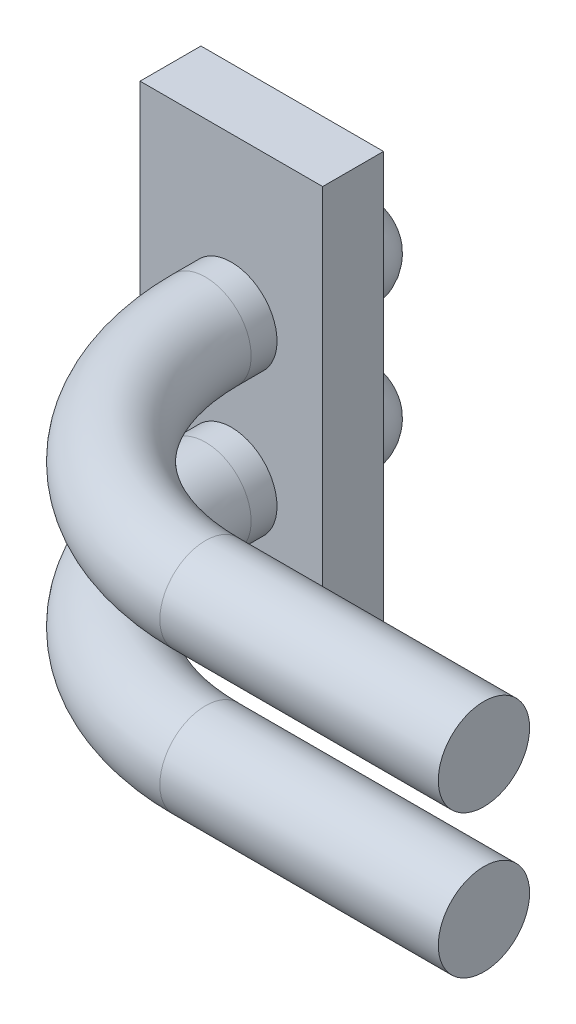
ISO-10303-21;
HEADER;
FILE_DESCRIPTION(('STEP AP214'),'2;1');
FILE_NAME('part.step','',(''),(''),'','','');
FILE_SCHEMA(('AUTOMOTIVE_DESIGN { 1 0 10303 214 1 1 1 1 }'));
ENDSEC;
DATA;
#1=APPLICATION_CONTEXT('core data for automotive mechanical design processes');
#2=APPLICATION_PROTOCOL_DEFINITION('international standard','automotive_design',2000,#1);
#3=PRODUCT_CONTEXT('',#1,'mechanical');
#4=PRODUCT('Part','Part','',(#3));
#5=PRODUCT_RELATED_PRODUCT_CATEGORY('part','',(#4));
#6=PRODUCT_DEFINITION_FORMATION('','',#4);
#7=PRODUCT_DEFINITION_CONTEXT('part definition',#1,'design');
#8=PRODUCT_DEFINITION('design','',#6,#7);
#9=PRODUCT_DEFINITION_SHAPE('','',#8);
#10=(LENGTH_UNIT() NAMED_UNIT(*) SI_UNIT(.MILLI.,.METRE.));
#11=(NAMED_UNIT(*) PLANE_ANGLE_UNIT() SI_UNIT($,.RADIAN.));
#12=(NAMED_UNIT(*) SI_UNIT($,.STERADIAN.) SOLID_ANGLE_UNIT());
#13=UNCERTAINTY_MEASURE_WITH_UNIT(LENGTH_MEASURE(1.E-05),#10,'distance_accuracy_value','');
#14=(GEOMETRIC_REPRESENTATION_CONTEXT(3) GLOBAL_UNCERTAINTY_ASSIGNED_CONTEXT((#13)) GLOBAL_UNIT_ASSIGNED_CONTEXT((#10,
#11,#12)) REPRESENTATION_CONTEXT('',''));
#15=CARTESIAN_POINT('',(0.,0.,0.));
#16=DIRECTION('',(0.,0.,1.));
#17=DIRECTION('',(1.,0.,0.));
#18=AXIS2_PLACEMENT_3D('',#15,#16,#17);
#19=CARTESIAN_POINT('',(3.00000000000001,7.5,2.));
#20=DIRECTION('',(0.,0.,-1.));
#21=DIRECTION('',(-1.,0.,0.));
#22=AXIS2_PLACEMENT_3D('',#19,#20,#21);
#23=PLANE('',#22);
#24=CARTESIAN_POINT('',(0.,-2.35,2.));
#25=DIRECTION('',(0.,0.,1.));
#26=DIRECTION('',(1.,0.,0.));
#27=AXIS2_PLACEMENT_3D('',#24,#25,#26);
#28=CIRCLE('',#27,1.5);
#29=CARTESIAN_POINT('',(1.5,-2.35,2.));
#30=VERTEX_POINT('',#29);
#31=EDGE_CURVE('E41',#30,#30,#28,.T.);
#32=ORIENTED_EDGE('',*,*,#31,.F.);
#33=EDGE_LOOP('',(#32));
#34=FACE_BOUND('',#33,.T.);
#35=DIRECTION('',(0.,1.,0.));
#36=VECTOR('',#35,1.);
#37=CARTESIAN_POINT('',(3.00000000000001,-7.5,2.));
#38=LINE('',#37,#36);
#39=CARTESIAN_POINT('',(3.00000000000001,-7.5,2.));
#40=VERTEX_POINT('',#39);
#41=CARTESIAN_POINT('',(3.00000000000001,7.5,2.));
#42=VERTEX_POINT('',#41);
#43=EDGE_CURVE('E86',#40,#42,#38,.T.);
#44=ORIENTED_EDGE('',*,*,#43,.T.);
#45=DIRECTION('',(-1.,0.,0.));
#46=VECTOR('',#45,1.);
#47=CARTESIAN_POINT('',(-3.,7.5,2.));
#48=LINE('',#47,#46);
#49=CARTESIAN_POINT('',(-3.,7.5,2.));
#50=VERTEX_POINT('',#49);
#51=EDGE_CURVE('E81',#42,#50,#48,.T.);
#52=ORIENTED_EDGE('',*,*,#51,.T.);
#53=DIRECTION('',(0.,-1.,0.));
#54=VECTOR('',#53,1.);
#55=CARTESIAN_POINT('',(-3.,-7.5,2.));
#56=LINE('',#55,#54);
#57=CARTESIAN_POINT('',(-3.,-7.5,2.));
#58=VERTEX_POINT('',#57);
#59=EDGE_CURVE('E84',#50,#58,#56,.T.);
#60=ORIENTED_EDGE('',*,*,#59,.T.);
#61=DIRECTION('',(1.,0.,0.));
#62=VECTOR('',#61,1.);
#63=CARTESIAN_POINT('',(-3.,-7.5,2.));
#64=LINE('',#63,#62);
#65=EDGE_CURVE('E50',#58,#40,#64,.T.);
#66=ORIENTED_EDGE('',*,*,#65,.T.);
#67=EDGE_LOOP('',(#44,#52,#60,#66));
#68=FACE_BOUND('',#67,.T.);
#69=CARTESIAN_POINT('',(0.,2.35,2.));
#70=DIRECTION('',(0.,0.,1.));
#71=DIRECTION('',(1.,0.,0.));
#72=AXIS2_PLACEMENT_3D('',#69,#70,#71);
#73=CIRCLE('',#72,1.5);
#74=CARTESIAN_POINT('',(1.5,2.35,2.));
#75=VERTEX_POINT('',#74);
#76=EDGE_CURVE('E11',#75,#75,#73,.T.);
#77=ORIENTED_EDGE('',*,*,#76,.F.);
#78=EDGE_LOOP('',(#77));
#79=FACE_BOUND('',#78,.T.);
#80=ADVANCED_FACE('F31',(#34,#68,#79),#23,.F.);
#81=CARTESIAN_POINT('',(3.00000000000001,7.5,0.));
#82=DIRECTION('',(0.,0.,-1.));
#83=DIRECTION('',(-1.,0.,0.));
#84=AXIS2_PLACEMENT_3D('',#81,#82,#83);
#85=PLANE('',#84);
#86=CARTESIAN_POINT('',(0.,2.35,0.));
#87=DIRECTION('',(0.,0.,-1.));
#88=DIRECTION('',(-1.,0.,0.));
#89=AXIS2_PLACEMENT_3D('',#86,#87,#88);
#90=CIRCLE('',#89,1.5);
#91=CARTESIAN_POINT('',(-1.5,2.35,0.));
#92=VERTEX_POINT('',#91);
#93=EDGE_CURVE('E104',#92,#92,#90,.T.);
#94=ORIENTED_EDGE('',*,*,#93,.F.);
#95=EDGE_LOOP('',(#94));
#96=FACE_BOUND('',#95,.T.);
#97=DIRECTION('',(0.,1.,0.));
#98=VECTOR('',#97,1.);
#99=CARTESIAN_POINT('',(3.00000000000001,-7.5,0.));
#100=LINE('',#99,#98);
#101=CARTESIAN_POINT('',(3.00000000000001,-7.5,0.));
#102=VERTEX_POINT('',#101);
#103=CARTESIAN_POINT('',(3.00000000000001,7.5,0.));
#104=VERTEX_POINT('',#103);
#105=EDGE_CURVE('E101',#102,#104,#100,.T.);
#106=ORIENTED_EDGE('',*,*,#105,.F.);
#107=DIRECTION('',(1.,0.,0.));
#108=VECTOR('',#107,1.);
#109=CARTESIAN_POINT('',(-3.,-7.5,0.));
#110=LINE('',#109,#108);
#111=CARTESIAN_POINT('',(-3.,-7.5,0.));
#112=VERTEX_POINT('',#111);
#113=EDGE_CURVE('E73',#112,#102,#110,.T.);
#114=ORIENTED_EDGE('',*,*,#113,.F.);
#115=DIRECTION('',(0.,-1.,0.));
#116=VECTOR('',#115,1.);
#117=CARTESIAN_POINT('',(-3.,-7.5,0.));
#118=LINE('',#117,#116);
#119=CARTESIAN_POINT('',(-3.,7.5,0.));
#120=VERTEX_POINT('',#119);
#121=EDGE_CURVE('E67',#120,#112,#118,.T.);
#122=ORIENTED_EDGE('',*,*,#121,.F.);
#123=DIRECTION('',(-1.,0.,0.));
#124=VECTOR('',#123,1.);
#125=CARTESIAN_POINT('',(-3.,7.5,0.));
#126=LINE('',#125,#124);
#127=EDGE_CURVE('E91',#104,#120,#126,.T.);
#128=ORIENTED_EDGE('',*,*,#127,.F.);
#129=EDGE_LOOP('',(#106,#114,#122,#128));
#130=FACE_BOUND('',#129,.T.);
#131=CARTESIAN_POINT('',(0.,-2.35,0.));
#132=DIRECTION('',(0.,0.,-1.));
#133=DIRECTION('',(-1.,0.,0.));
#134=AXIS2_PLACEMENT_3D('',#131,#132,#133);
#135=CIRCLE('',#134,1.5);
#136=CARTESIAN_POINT('',(-1.5,-2.35,0.));
#137=VERTEX_POINT('',#136);
#138=EDGE_CURVE('E131',#137,#137,#135,.T.);
#139=ORIENTED_EDGE('',*,*,#138,.F.);
#140=EDGE_LOOP('',(#139));
#141=FACE_BOUND('',#140,.T.);
#142=ADVANCED_FACE('F139',(#96,#130,#141),#85,.T.);
#143=CARTESIAN_POINT('',(3.00000000000001,-7.5,2.));
#144=DIRECTION('',(-1.,0.,0.));
#145=DIRECTION('',(0.,0.,1.));
#146=AXIS2_PLACEMENT_3D('',#143,#144,#145);
#147=PLANE('',#146);
#148=ORIENTED_EDGE('',*,*,#105,.T.);
#149=DIRECTION('',(0.,0.,-1.));
#150=VECTOR('',#149,1.);
#151=CARTESIAN_POINT('',(3.00000000000001,7.5,2.));
#152=LINE('',#151,#150);
#153=EDGE_CURVE('E92',#42,#104,#152,.T.);
#154=ORIENTED_EDGE('',*,*,#153,.F.);
#155=ORIENTED_EDGE('',*,*,#43,.F.);
#156=DIRECTION('',(0.,0.,-1.));
#157=VECTOR('',#156,1.);
#158=CARTESIAN_POINT('',(3.00000000000001,-7.5,2.));
#159=LINE('',#158,#157);
#160=EDGE_CURVE('E97',#40,#102,#159,.T.);
#161=ORIENTED_EDGE('',*,*,#160,.T.);
#162=EDGE_LOOP('',(#148,#154,#155,#161));
#163=FACE_BOUND('',#162,.T.);
#164=ADVANCED_FACE('F142',(#163),#147,.F.);
#165=CARTESIAN_POINT('',(-3.,7.5,2.));
#166=DIRECTION('',(0.,-1.,0.));
#167=DIRECTION('',(0.,0.,-1.));
#168=AXIS2_PLACEMENT_3D('',#165,#166,#167);
#169=PLANE('',#168);
#170=ORIENTED_EDGE('',*,*,#127,.T.);
#171=DIRECTION('',(0.,0.,-1.));
#172=VECTOR('',#171,1.);
#173=CARTESIAN_POINT('',(-3.,7.5,2.));
#174=LINE('',#173,#172);
#175=EDGE_CURVE('E89',#50,#120,#174,.T.);
#176=ORIENTED_EDGE('',*,*,#175,.F.);
#177=ORIENTED_EDGE('',*,*,#51,.F.);
#178=ORIENTED_EDGE('',*,*,#153,.T.);
#179=EDGE_LOOP('',(#170,#176,#177,#178));
#180=FACE_BOUND('',#179,.T.);
#181=ADVANCED_FACE('F90',(#180),#169,.F.);
#182=CARTESIAN_POINT('',(-3.,-7.5,2.));
#183=DIRECTION('',(1.,0.,0.));
#184=DIRECTION('',(0.,0.,-1.));
#185=AXIS2_PLACEMENT_3D('',#182,#183,#184);
#186=PLANE('',#185);
#187=ORIENTED_EDGE('',*,*,#121,.T.);
#188=DIRECTION('',(0.,0.,-1.));
#189=VECTOR('',#188,1.);
#190=CARTESIAN_POINT('',(-3.,-7.5,2.));
#191=LINE('',#190,#189);
#192=EDGE_CURVE('E93',#58,#112,#191,.T.);
#193=ORIENTED_EDGE('',*,*,#192,.F.);
#194=ORIENTED_EDGE('',*,*,#59,.F.);
#195=ORIENTED_EDGE('',*,*,#175,.T.);
#196=EDGE_LOOP('',(#187,#193,#194,#195));
#197=FACE_BOUND('',#196,.T.);
#198=ADVANCED_FACE('F95',(#197),#186,.F.);
#199=CARTESIAN_POINT('',(-3.,-7.5,2.));
#200=DIRECTION('',(0.,1.,0.));
#201=DIRECTION('',(0.,0.,1.));
#202=AXIS2_PLACEMENT_3D('',#199,#200,#201);
#203=PLANE('',#202);
#204=ORIENTED_EDGE('',*,*,#113,.T.);
#205=ORIENTED_EDGE('',*,*,#160,.F.);
#206=ORIENTED_EDGE('',*,*,#65,.F.);
#207=ORIENTED_EDGE('',*,*,#192,.T.);
#208=EDGE_LOOP('',(#204,#205,#206,#207));
#209=FACE_BOUND('',#208,.T.);
#210=ADVANCED_FACE('F157',(#209),#203,.F.);
#211=CARTESIAN_POINT('',(0.,2.35,-3.));
#212=DIRECTION('',(0.,0.,1.));
#213=DIRECTION('',(1.,0.,0.));
#214=AXIS2_PLACEMENT_3D('',#211,#212,#213);
#215=CYLINDRICAL_SURFACE('',#214,1.5);
#216=CARTESIAN_POINT('',(0.,2.35,-1.5));
#217=DIRECTION('',(0.,0.,1.));
#218=DIRECTION('',(1.,0.,0.));
#219=AXIS2_PLACEMENT_3D('',#216,#217,#218);
#220=CIRCLE('',#219,1.5);
#221=CARTESIAN_POINT('',(1.5,2.35,-1.5));
#222=VERTEX_POINT('',#221);
#223=EDGE_CURVE('E35',#222,#222,#220,.T.);
#224=ORIENTED_EDGE('',*,*,#223,.T.);
#225=EDGE_LOOP('',(#224));
#226=FACE_BOUND('',#225,.T.);
#227=ORIENTED_EDGE('',*,*,#93,.T.);
#228=EDGE_LOOP('',(#227));
#229=FACE_BOUND('',#228,.T.);
#230=ADVANCED_FACE('F137',(#226,#229),#215,.T.);
#231=CARTESIAN_POINT('',(0.,-2.35,-3.));
#232=DIRECTION('',(0.,0.,1.));
#233=DIRECTION('',(1.,0.,0.));
#234=AXIS2_PLACEMENT_3D('',#231,#232,#233);
#235=CYLINDRICAL_SURFACE('',#234,1.5);
#236=CARTESIAN_POINT('',(0.,-2.35,-1.5));
#237=DIRECTION('',(0.,0.,1.));
#238=DIRECTION('',(1.,0.,0.));
#239=AXIS2_PLACEMENT_3D('',#236,#237,#238);
#240=CIRCLE('',#239,1.5);
#241=CARTESIAN_POINT('',(1.5,-2.35,-1.5));
#242=VERTEX_POINT('',#241);
#243=EDGE_CURVE('E110',#242,#242,#240,.T.);
#244=ORIENTED_EDGE('',*,*,#243,.T.);
#245=EDGE_LOOP('',(#244));
#246=FACE_BOUND('',#245,.T.);
#247=ORIENTED_EDGE('',*,*,#138,.T.);
#248=EDGE_LOOP('',(#247));
#249=FACE_BOUND('',#248,.T.);
#250=ADVANCED_FACE('F148',(#246,#249),#235,.T.);
#251=CARTESIAN_POINT('',(0.,-2.35,-1.5));
#252=DIRECTION('',(0.,0.,1.));
#253=DIRECTION('',(1.,0.,0.));
#254=AXIS2_PLACEMENT_3D('',#251,#252,#253);
#255=SPHERICAL_SURFACE('',#254,1.5);
#256=ORIENTED_EDGE('',*,*,#243,.F.);
#257=EDGE_LOOP('',(#256));
#258=FACE_BOUND('',#257,.T.);
#259=ADVANCED_FACE('F150',(#258),#255,.T.);
#260=CARTESIAN_POINT('',(0.,2.35,-1.5));
#261=DIRECTION('',(0.,0.,1.));
#262=DIRECTION('',(1.,0.,0.));
#263=AXIS2_PLACEMENT_3D('',#260,#261,#262);
#264=SPHERICAL_SURFACE('',#263,1.5);
#265=ORIENTED_EDGE('',*,*,#223,.F.);
#266=EDGE_LOOP('',(#265));
#267=FACE_BOUND('',#266,.T.);
#268=ADVANCED_FACE('F33',(#267),#264,.T.);
#269=CARTESIAN_POINT('',(7.5,-2.35,10.35));
#270=DIRECTION('',(1.,0.,0.));
#271=DIRECTION('',(0.,0.,-1.));
#272=AXIS2_PLACEMENT_3D('',#269,#270,#271);
#273=CYLINDRICAL_SURFACE('',#272,1.5);
#274=CARTESIAN_POINT('',(7.5,-2.35,10.35));
#275=DIRECTION('',(1.,0.,0.));
#276=DIRECTION('',(0.,0.,-1.));
#277=AXIS2_PLACEMENT_3D('',#274,#275,#276);
#278=CIRCLE('',#277,1.5);
#279=CARTESIAN_POINT('',(7.5,-2.35,11.85));
#280=VERTEX_POINT('',#279);
#281=EDGE_CURVE('E125',#280,#280,#278,.T.);
#282=ORIENTED_EDGE('',*,*,#281,.T.);
#283=EDGE_LOOP('',(#282));
#284=FACE_BOUND('',#283,.T.);
#285=CARTESIAN_POINT('',(16.65,-2.35,10.35));
#286=DIRECTION('',(1.,0.,0.));
#287=DIRECTION('',(0.,0.,-1.));
#288=AXIS2_PLACEMENT_3D('',#285,#286,#287);
#289=CIRCLE('',#288,1.5);
#290=CARTESIAN_POINT('',(16.65,-2.35,8.85));
#291=VERTEX_POINT('',#290);
#292=EDGE_CURVE('E128',#291,#291,#289,.T.);
#293=ORIENTED_EDGE('',*,*,#292,.F.);
#294=EDGE_LOOP('',(#293));
#295=FACE_BOUND('',#294,.T.);
#296=ADVANCED_FACE('F214',(#284,#295),#273,.T.);
#297=CARTESIAN_POINT('',(7.5,-2.35,2.85));
#298=DIRECTION('',(0.,1.,0.));
#299=DIRECTION('',(0.,0.,1.));
#300=AXIS2_PLACEMENT_3D('',#297,#298,#299);
#301=TOROIDAL_SURFACE('',#300,7.5,1.5);
#302=CARTESIAN_POINT('',(0.,-2.35,2.85));
#303=DIRECTION('',(0.,0.,1.));
#304=DIRECTION('',(1.,0.,0.));
#305=AXIS2_PLACEMENT_3D('',#302,#303,#304);
#306=CIRCLE('',#305,1.5);
#307=CARTESIAN_POINT('',(-1.5,-2.35,2.85));
#308=VERTEX_POINT('',#307);
#309=EDGE_CURVE('E123',#308,#308,#306,.T.);
#310=CARTESIAN_POINT('',(7.5,-2.35,2.85));
#311=DIRECTION('',(0.,1.,0.));
#312=DIRECTION('',(0.,0.,1.));
#313=AXIS2_PLACEMENT_3D('',#310,#311,#312);
#314=CIRCLE('',#313,9.);
#315=EDGE_CURVE('',#308,#280,#314,.T.);
#316=ORIENTED_EDGE('',*,*,#309,.T.);
#317=ORIENTED_EDGE('',*,*,#281,.F.);
#318=ORIENTED_EDGE('',*,*,#315,.T.);
#319=ORIENTED_EDGE('',*,*,#315,.F.);
#320=EDGE_LOOP('',(#316,#318,#317,#319));
#321=FACE_BOUND('',#320,.T.);
#322=ADVANCED_FACE('F228',(#321),#301,.T.);
#323=CARTESIAN_POINT('',(0.,-2.35,2.85));
#324=DIRECTION('',(0.,0.,-1.));
#325=DIRECTION('',(-1.,0.,0.));
#326=AXIS2_PLACEMENT_3D('',#323,#324,#325);
#327=CYLINDRICAL_SURFACE('',#326,1.5);
#328=ORIENTED_EDGE('',*,*,#309,.F.);
#329=EDGE_LOOP('',(#328));
#330=FACE_BOUND('',#329,.T.);
#331=ORIENTED_EDGE('',*,*,#31,.T.);
#332=EDGE_LOOP('',(#331));
#333=FACE_BOUND('',#332,.T.);
#334=ADVANCED_FACE('F237',(#330,#333),#327,.T.);
#335=CARTESIAN_POINT('',(16.65,-2.35,10.35));
#336=DIRECTION('',(1.,0.,0.));
#337=DIRECTION('',(0.,0.,-1.));
#338=AXIS2_PLACEMENT_3D('',#335,#336,#337);
#339=PLANE('',#338);
#340=ORIENTED_EDGE('',*,*,#292,.T.);
#341=EDGE_LOOP('',(#340));
#342=FACE_BOUND('',#341,.T.);
#343=ADVANCED_FACE('F247',(#342),#339,.T.);
#344=CARTESIAN_POINT('',(7.5,2.35,10.35));
#345=DIRECTION('',(1.,0.,0.));
#346=DIRECTION('',(0.,0.,-1.));
#347=AXIS2_PLACEMENT_3D('',#344,#345,#346);
#348=CYLINDRICAL_SURFACE('',#347,1.5);
#349=CARTESIAN_POINT('',(7.5,2.35,10.35));
#350=DIRECTION('',(1.,0.,0.));
#351=DIRECTION('',(0.,0.,-1.));
#352=AXIS2_PLACEMENT_3D('',#349,#350,#351);
#353=CIRCLE('',#352,1.5);
#354=CARTESIAN_POINT('',(7.5,2.35,11.85));
#355=VERTEX_POINT('',#354);
#356=EDGE_CURVE('E305',#355,#355,#353,.T.);
#357=ORIENTED_EDGE('',*,*,#356,.T.);
#358=EDGE_LOOP('',(#357));
#359=FACE_BOUND('',#358,.T.);
#360=CARTESIAN_POINT('',(16.65,2.35,10.35));
#361=DIRECTION('',(1.,0.,0.));
#362=DIRECTION('',(0.,0.,-1.));
#363=AXIS2_PLACEMENT_3D('',#360,#361,#362);
#364=CIRCLE('',#363,1.5);
#365=CARTESIAN_POINT('',(16.65,2.35,8.85));
#366=VERTEX_POINT('',#365);
#367=EDGE_CURVE('E303',#366,#366,#364,.T.);
#368=ORIENTED_EDGE('',*,*,#367,.F.);
#369=EDGE_LOOP('',(#368));
#370=FACE_BOUND('',#369,.T.);
#371=ADVANCED_FACE('F257',(#359,#370),#348,.T.);
#372=CARTESIAN_POINT('',(7.5,2.35,2.85));
#373=DIRECTION('',(0.,1.,0.));
#374=DIRECTION('',(0.,0.,1.));
#375=AXIS2_PLACEMENT_3D('',#372,#373,#374);
#376=TOROIDAL_SURFACE('',#375,7.5,1.5);
#377=CARTESIAN_POINT('',(0.,2.35,2.85));
#378=DIRECTION('',(0.,0.,1.));
#379=DIRECTION('',(1.,0.,0.));
#380=AXIS2_PLACEMENT_3D('',#377,#378,#379);
#381=CIRCLE('',#380,1.5);
#382=CARTESIAN_POINT('',(-1.5,2.35,2.85));
#383=VERTEX_POINT('',#382);
#384=EDGE_CURVE('E308',#383,#383,#381,.T.);
#385=CARTESIAN_POINT('',(7.5,2.35,2.85));
#386=DIRECTION('',(0.,1.,0.));
#387=DIRECTION('',(0.,0.,1.));
#388=AXIS2_PLACEMENT_3D('',#385,#386,#387);
#389=CIRCLE('',#388,9.);
#390=EDGE_CURVE('',#383,#355,#389,.T.);
#391=ORIENTED_EDGE('',*,*,#384,.T.);
#392=ORIENTED_EDGE('',*,*,#356,.F.);
#393=ORIENTED_EDGE('',*,*,#390,.T.);
#394=ORIENTED_EDGE('',*,*,#390,.F.);
#395=EDGE_LOOP('',(#391,#393,#392,#394));
#396=FACE_BOUND('',#395,.T.);
#397=ADVANCED_FACE('F267',(#396),#376,.T.);
#398=CARTESIAN_POINT('',(0.,2.35,2.85));
#399=DIRECTION('',(0.,0.,-1.));
#400=DIRECTION('',(-1.,0.,0.));
#401=AXIS2_PLACEMENT_3D('',#398,#399,#400);
#402=CYLINDRICAL_SURFACE('',#401,1.5);
#403=ORIENTED_EDGE('',*,*,#384,.F.);
#404=EDGE_LOOP('',(#403));
#405=FACE_BOUND('',#404,.T.);
#406=ORIENTED_EDGE('',*,*,#76,.T.);
#407=EDGE_LOOP('',(#406));
#408=FACE_BOUND('',#407,.T.);
#409=ADVANCED_FACE('F277',(#405,#408),#402,.T.);
#410=CARTESIAN_POINT('',(16.65,2.35,10.35));
#411=DIRECTION('',(1.,0.,0.));
#412=DIRECTION('',(0.,0.,-1.));
#413=AXIS2_PLACEMENT_3D('',#410,#411,#412);
#414=PLANE('',#413);
#415=ORIENTED_EDGE('',*,*,#367,.T.);
#416=EDGE_LOOP('',(#415));
#417=FACE_BOUND('',#416,.T.);
#418=ADVANCED_FACE('F287',(#417),#414,.T.);
#419=CLOSED_SHELL('',(#80,#142,#164,#181,#198,#210,#230,#250,#259,#268,#296,#322,#334,#343,#371,
#397,#409,#418));
#420=MANIFOLD_SOLID_BREP('B2',#419);
#421=ADVANCED_BREP_SHAPE_REPRESENTATION('',(#18,#420),#14);
#422=SHAPE_DEFINITION_REPRESENTATION(#9,#421);
ENDSEC;
END-ISO-10303-21;
